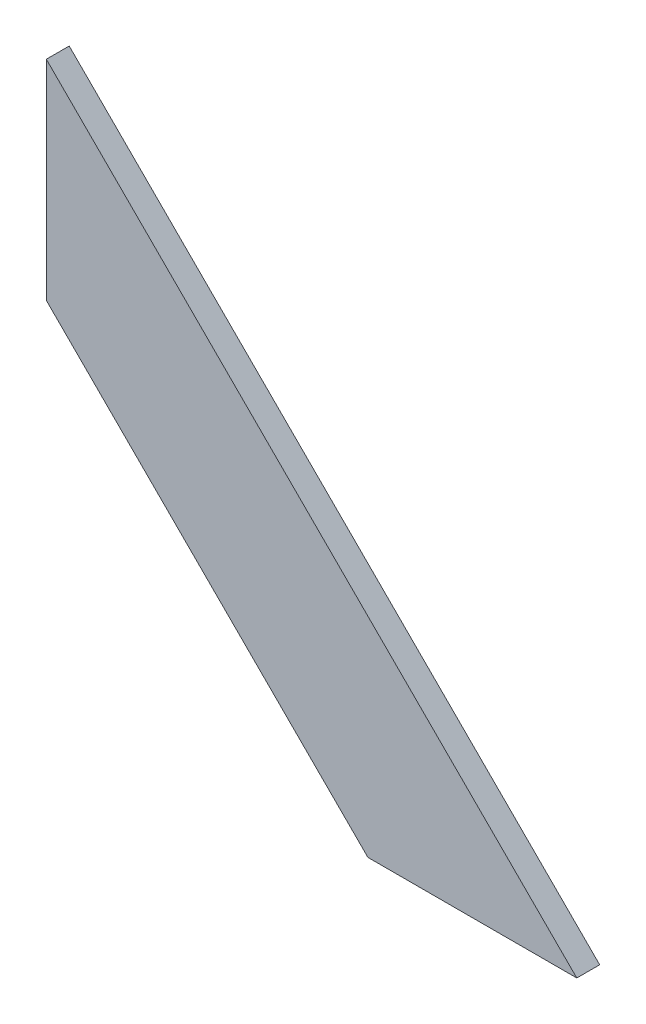
ISO-10303-21;
HEADER;
FILE_DESCRIPTION(('STEP AP214'),'2;1');
FILE_NAME('part.step','',(''),(''),'','','');
FILE_SCHEMA(('AUTOMOTIVE_DESIGN { 1 0 10303 214 1 1 1 1 }'));
ENDSEC;
DATA;
#1=APPLICATION_CONTEXT('core data for automotive mechanical design processes');
#2=APPLICATION_PROTOCOL_DEFINITION('international standard','automotive_design',2000,#1);
#3=PRODUCT_CONTEXT('',#1,'mechanical');
#4=PRODUCT('Part','Part','',(#3));
#5=PRODUCT_RELATED_PRODUCT_CATEGORY('part','',(#4));
#6=PRODUCT_DEFINITION_FORMATION('','',#4);
#7=PRODUCT_DEFINITION_CONTEXT('part definition',#1,'design');
#8=PRODUCT_DEFINITION('design','',#6,#7);
#9=PRODUCT_DEFINITION_SHAPE('','',#8);
#10=(LENGTH_UNIT() NAMED_UNIT(*) SI_UNIT(.MILLI.,.METRE.));
#11=(NAMED_UNIT(*) PLANE_ANGLE_UNIT() SI_UNIT($,.RADIAN.));
#12=(NAMED_UNIT(*) SI_UNIT($,.STERADIAN.) SOLID_ANGLE_UNIT());
#13=UNCERTAINTY_MEASURE_WITH_UNIT(LENGTH_MEASURE(1.E-05),#10,'distance_accuracy_value','');
#14=(GEOMETRIC_REPRESENTATION_CONTEXT(3) GLOBAL_UNCERTAINTY_ASSIGNED_CONTEXT((#13)) GLOBAL_UNIT_ASSIGNED_CONTEXT((#10,
#11,#12)) REPRESENTATION_CONTEXT('',''));
#15=CARTESIAN_POINT('',(0.,0.,0.));
#16=DIRECTION('',(0.,0.,1.));
#17=DIRECTION('',(1.,0.,0.));
#18=AXIS2_PLACEMENT_3D('',#15,#16,#17);
#19=CARTESIAN_POINT('',(0.,510.,70.));
#20=DIRECTION('',(-1.,0.,0.));
#21=DIRECTION('',(0.,0.,1.));
#22=AXIS2_PLACEMENT_3D('',#19,#20,#21);
#23=PLANE('',#22);
#24=DIRECTION('',(0.,1.,0.));
#25=VECTOR('',#24,1.);
#26=CARTESIAN_POINT('',(0.,0.,70.));
#27=LINE('',#26,#25);
#28=CARTESIAN_POINT('',(0.,309.18167414302,70.));
#29=VERTEX_POINT('',#28);
#30=CARTESIAN_POINT('',(0.,510.,70.));
#31=VERTEX_POINT('',#30);
#32=EDGE_CURVE('E20',#29,#31,#27,.T.);
#33=ORIENTED_EDGE('',*,*,#32,.F.);
#34=DIRECTION('',(0.,0.,1.));
#35=VECTOR('',#34,1.);
#36=CARTESIAN_POINT('',(0.,309.18167414302,70.));
#37=LINE('',#36,#35);
#38=CARTESIAN_POINT('',(0.,309.18167414302,92.));
#39=VERTEX_POINT('',#38);
#40=EDGE_CURVE('E11',#29,#39,#37,.T.);
#41=ORIENTED_EDGE('',*,*,#40,.T.);
#42=DIRECTION('',(0.,-1.,0.));
#43=VECTOR('',#42,1.);
#44=CARTESIAN_POINT('',(0.,0.,92.));
#45=LINE('',#44,#43);
#46=CARTESIAN_POINT('',(0.,510.,92.));
#47=VERTEX_POINT('',#46);
#48=EDGE_CURVE('E80',#47,#39,#45,.T.);
#49=ORIENTED_EDGE('',*,*,#48,.F.);
#50=DIRECTION('',(0.,0.,1.));
#51=VECTOR('',#50,1.);
#52=CARTESIAN_POINT('',(0.,510.,70.));
#53=LINE('',#52,#51);
#54=EDGE_CURVE('E27',#31,#47,#53,.T.);
#55=ORIENTED_EDGE('',*,*,#54,.F.);
#56=EDGE_LOOP('',(#33,#41,#49,#55));
#57=FACE_BOUND('',#56,.T.);
#58=ADVANCED_FACE('F16',(#57),#23,.T.);
#59=CARTESIAN_POINT('',(510.,0.,70.));
#60=DIRECTION('',(0.707106781186547,0.707106781186548,0.));
#61=DIRECTION('',(0.,0.,-1.));
#62=AXIS2_PLACEMENT_3D('',#59,#60,#61);
#63=PLANE('',#62);
#64=DIRECTION('',(0.707106781186548,-0.707106781186547,0.));
#65=VECTOR('',#64,1.);
#66=CARTESIAN_POINT('',(-22.,532.,70.));
#67=LINE('',#66,#65);
#68=CARTESIAN_POINT('',(510.,0.,70.));
#69=VERTEX_POINT('',#68);
#70=EDGE_CURVE('E58',#31,#69,#67,.T.);
#71=ORIENTED_EDGE('',*,*,#70,.F.);
#72=ORIENTED_EDGE('',*,*,#54,.T.);
#73=DIRECTION('',(-0.707106781186548,0.707106781186547,0.));
#74=VECTOR('',#73,1.);
#75=CARTESIAN_POINT('',(-22.,532.,92.));
#76=LINE('',#75,#74);
#77=CARTESIAN_POINT('',(510.,0.,92.));
#78=VERTEX_POINT('',#77);
#79=EDGE_CURVE('E87',#78,#47,#76,.T.);
#80=ORIENTED_EDGE('',*,*,#79,.F.);
#81=DIRECTION('',(0.,0.,1.));
#82=VECTOR('',#81,1.);
#83=CARTESIAN_POINT('',(510.,0.,70.));
#84=LINE('',#83,#82);
#85=EDGE_CURVE('E92',#69,#78,#84,.T.);
#86=ORIENTED_EDGE('',*,*,#85,.F.);
#87=EDGE_LOOP('',(#71,#72,#80,#86));
#88=FACE_BOUND('',#87,.T.);
#89=ADVANCED_FACE('F90',(#88),#63,.T.);
#90=CARTESIAN_POINT('',(309.181674143021,0.,70.));
#91=DIRECTION('',(0.,-1.,0.));
#92=DIRECTION('',(0.,0.,-1.));
#93=AXIS2_PLACEMENT_3D('',#90,#91,#92);
#94=PLANE('',#93);
#95=DIRECTION('',(-1.,0.,0.));
#96=VECTOR('',#95,1.);
#97=CARTESIAN_POINT('',(510.,0.,70.));
#98=LINE('',#97,#96);
#99=CARTESIAN_POINT('',(309.181674143021,0.,70.));
#100=VERTEX_POINT('',#99);
#101=EDGE_CURVE('E75',#69,#100,#98,.T.);
#102=ORIENTED_EDGE('',*,*,#101,.F.);
#103=ORIENTED_EDGE('',*,*,#85,.T.);
#104=DIRECTION('',(1.,0.,0.));
#105=VECTOR('',#104,1.);
#106=CARTESIAN_POINT('',(510.,0.,92.));
#107=LINE('',#106,#105);
#108=CARTESIAN_POINT('',(309.181674143021,0.,92.));
#109=VERTEX_POINT('',#108);
#110=EDGE_CURVE('E69',#109,#78,#107,.T.);
#111=ORIENTED_EDGE('',*,*,#110,.F.);
#112=DIRECTION('',(0.,0.,1.));
#113=VECTOR('',#112,1.);
#114=CARTESIAN_POINT('',(309.181674143021,0.,70.));
#115=LINE('',#114,#113);
#116=EDGE_CURVE('E108',#100,#109,#115,.T.);
#117=ORIENTED_EDGE('',*,*,#116,.F.);
#118=EDGE_LOOP('',(#102,#103,#111,#117));
#119=FACE_BOUND('',#118,.T.);
#120=ADVANCED_FACE('F141',(#119),#94,.T.);
#121=CARTESIAN_POINT('',(0.,309.18167414302,70.));
#122=DIRECTION('',(-0.707106781186548,-0.707106781186548,0.));
#123=DIRECTION('',(-0.707106781186548,0.707106781186548,0.));
#124=AXIS2_PLACEMENT_3D('',#121,#122,#123);
#125=PLANE('',#124);
#126=DIRECTION('',(0.707106781186548,-0.707106781186548,0.));
#127=VECTOR('',#126,1.);
#128=CARTESIAN_POINT('',(-22.,331.18167414302,70.));
#129=LINE('',#128,#127);
#130=EDGE_CURVE('E105',#29,#100,#129,.T.);
#131=ORIENTED_EDGE('',*,*,#130,.T.);
#132=ORIENTED_EDGE('',*,*,#116,.T.);
#133=DIRECTION('',(0.707106781186548,-0.707106781186548,0.));
#134=VECTOR('',#133,1.);
#135=CARTESIAN_POINT('',(-22.,331.18167414302,92.));
#136=LINE('',#135,#134);
#137=EDGE_CURVE('E101',#39,#109,#136,.T.);
#138=ORIENTED_EDGE('',*,*,#137,.F.);
#139=ORIENTED_EDGE('',*,*,#40,.F.);
#140=EDGE_LOOP('',(#131,#132,#138,#139));
#141=FACE_BOUND('',#140,.T.);
#142=ADVANCED_FACE('F134',(#141),#125,.T.);
#143=CARTESIAN_POINT('',(255.,255.,92.));
#144=DIRECTION('',(0.,0.,1.));
#145=DIRECTION('',(1.,0.,0.));
#146=AXIS2_PLACEMENT_3D('',#143,#144,#145);
#147=PLANE('',#146);
#148=ORIENTED_EDGE('',*,*,#137,.T.);
#149=ORIENTED_EDGE('',*,*,#110,.T.);
#150=ORIENTED_EDGE('',*,*,#79,.T.);
#151=ORIENTED_EDGE('',*,*,#48,.T.);
#152=EDGE_LOOP('',(#148,#149,#150,#151));
#153=FACE_BOUND('',#152,.T.);
#154=ADVANCED_FACE('F94',(#153),#147,.T.);
#155=CARTESIAN_POINT('',(255.,255.,70.));
#156=DIRECTION('',(0.,0.,1.));
#157=DIRECTION('',(1.,0.,0.));
#158=AXIS2_PLACEMENT_3D('',#155,#156,#157);
#159=PLANE('',#158);
#160=ORIENTED_EDGE('',*,*,#130,.F.);
#161=ORIENTED_EDGE('',*,*,#32,.T.);
#162=ORIENTED_EDGE('',*,*,#70,.T.);
#163=ORIENTED_EDGE('',*,*,#101,.T.);
#164=EDGE_LOOP('',(#160,#161,#162,#163));
#165=FACE_BOUND('',#164,.T.);
#166=ADVANCED_FACE('F18',(#165),#159,.F.);
#167=CLOSED_SHELL('',(#58,#89,#120,#142,#154,#166));
#168=MANIFOLD_SOLID_BREP('B1',#167);
#169=ADVANCED_BREP_SHAPE_REPRESENTATION('',(#18,#168),#14);
#170=SHAPE_DEFINITION_REPRESENTATION(#9,#169);
ENDSEC;
END-ISO-10303-21;
